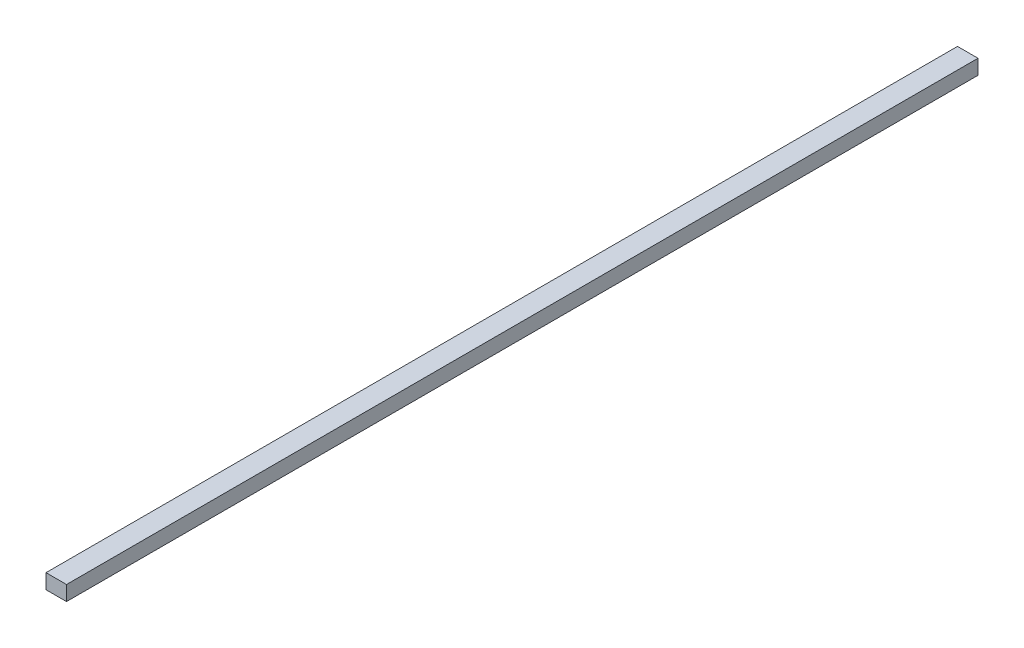
ISO-10303-21;
HEADER;
FILE_DESCRIPTION(('STEP AP214'),'2;1');
FILE_NAME('part.step','',(''),(''),'','','');
FILE_SCHEMA(('AUTOMOTIVE_DESIGN { 1 0 10303 214 1 1 1 1 }'));
ENDSEC;
DATA;
#1=APPLICATION_CONTEXT('core data for automotive mechanical design processes');
#2=APPLICATION_PROTOCOL_DEFINITION('international standard','automotive_design',2000,#1);
#3=PRODUCT_CONTEXT('',#1,'mechanical');
#4=PRODUCT('Part','Part','',(#3));
#5=PRODUCT_RELATED_PRODUCT_CATEGORY('part','',(#4));
#6=PRODUCT_DEFINITION_FORMATION('','',#4);
#7=PRODUCT_DEFINITION_CONTEXT('part definition',#1,'design');
#8=PRODUCT_DEFINITION('design','',#6,#7);
#9=PRODUCT_DEFINITION_SHAPE('','',#8);
#10=(LENGTH_UNIT() NAMED_UNIT(*) SI_UNIT(.MILLI.,.METRE.));
#11=(NAMED_UNIT(*) PLANE_ANGLE_UNIT() SI_UNIT($,.RADIAN.));
#12=(NAMED_UNIT(*) SI_UNIT($,.STERADIAN.) SOLID_ANGLE_UNIT());
#13=UNCERTAINTY_MEASURE_WITH_UNIT(LENGTH_MEASURE(1.E-05),#10,'distance_accuracy_value','');
#14=(GEOMETRIC_REPRESENTATION_CONTEXT(3) GLOBAL_UNCERTAINTY_ASSIGNED_CONTEXT((#13)) GLOBAL_UNIT_ASSIGNED_CONTEXT((#10,
#11,#12)) REPRESENTATION_CONTEXT('',''));
#15=CARTESIAN_POINT('',(0.,0.,0.));
#16=DIRECTION('',(0.,0.,1.));
#17=DIRECTION('',(1.,0.,0.));
#18=AXIS2_PLACEMENT_3D('',#15,#16,#17);
#19=CARTESIAN_POINT('',(0.,0.,400.));
#20=DIRECTION('',(1.,0.,0.));
#21=DIRECTION('',(0.,0.,-1.));
#22=AXIS2_PLACEMENT_3D('',#19,#20,#21);
#23=PLANE('',#22);
#24=DIRECTION('',(0.,-1.,0.));
#25=VECTOR('',#24,1.);
#26=CARTESIAN_POINT('',(0.,0.,0.));
#27=LINE('',#26,#25);
#28=CARTESIAN_POINT('',(0.,6.5,0.));
#29=VERTEX_POINT('',#28);
#30=CARTESIAN_POINT('',(0.,0.,0.));
#31=VERTEX_POINT('',#30);
#32=EDGE_CURVE('E98',#29,#31,#27,.T.);
#33=ORIENTED_EDGE('',*,*,#32,.T.);
#34=DIRECTION('',(0.,0.,-1.));
#35=VECTOR('',#34,1.);
#36=CARTESIAN_POINT('',(0.,0.,400.));
#37=LINE('',#36,#35);
#38=CARTESIAN_POINT('',(0.,0.,400.));
#39=VERTEX_POINT('',#38);
#40=EDGE_CURVE('E11',#39,#31,#37,.T.);
#41=ORIENTED_EDGE('',*,*,#40,.F.);
#42=DIRECTION('',(0.,-1.,0.));
#43=VECTOR('',#42,1.);
#44=CARTESIAN_POINT('',(0.,0.,400.));
#45=LINE('',#44,#43);
#46=CARTESIAN_POINT('',(0.,6.5,400.));
#47=VERTEX_POINT('',#46);
#48=EDGE_CURVE('E86',#47,#39,#45,.T.);
#49=ORIENTED_EDGE('',*,*,#48,.F.);
#50=DIRECTION('',(0.,0.,-1.));
#51=VECTOR('',#50,1.);
#52=CARTESIAN_POINT('',(0.,6.5,400.));
#53=LINE('',#52,#51);
#54=EDGE_CURVE('E94',#47,#29,#53,.T.);
#55=ORIENTED_EDGE('',*,*,#54,.T.);
#56=EDGE_LOOP('',(#33,#41,#49,#55));
#57=FACE_BOUND('',#56,.T.);
#58=ADVANCED_FACE('F35',(#57),#23,.F.);
#59=CARTESIAN_POINT('',(0.,0.,400.));
#60=DIRECTION('',(0.,1.,0.));
#61=DIRECTION('',(0.,0.,1.));
#62=AXIS2_PLACEMENT_3D('',#59,#60,#61);
#63=PLANE('',#62);
#64=DIRECTION('',(1.,0.,0.));
#65=VECTOR('',#64,1.);
#66=CARTESIAN_POINT('',(0.,0.,0.));
#67=LINE('',#66,#65);
#68=CARTESIAN_POINT('',(9.,0.,0.));
#69=VERTEX_POINT('',#68);
#70=EDGE_CURVE('E90',#31,#69,#67,.T.);
#71=ORIENTED_EDGE('',*,*,#70,.T.);
#72=DIRECTION('',(0.,0.,-1.));
#73=VECTOR('',#72,1.);
#74=CARTESIAN_POINT('',(9.,0.,400.));
#75=LINE('',#74,#73);
#76=CARTESIAN_POINT('',(9.,0.,400.));
#77=VERTEX_POINT('',#76);
#78=EDGE_CURVE('E43',#77,#69,#75,.T.);
#79=ORIENTED_EDGE('',*,*,#78,.F.);
#80=DIRECTION('',(1.,0.,0.));
#81=VECTOR('',#80,1.);
#82=CARTESIAN_POINT('',(0.,0.,400.));
#83=LINE('',#82,#81);
#84=EDGE_CURVE('E81',#39,#77,#83,.T.);
#85=ORIENTED_EDGE('',*,*,#84,.F.);
#86=ORIENTED_EDGE('',*,*,#40,.T.);
#87=EDGE_LOOP('',(#71,#79,#85,#86));
#88=FACE_BOUND('',#87,.T.);
#89=ADVANCED_FACE('F89',(#88),#63,.F.);
#90=CARTESIAN_POINT('',(9.,0.,400.));
#91=DIRECTION('',(-1.,0.,0.));
#92=DIRECTION('',(0.,0.,1.));
#93=AXIS2_PLACEMENT_3D('',#90,#91,#92);
#94=PLANE('',#93);
#95=DIRECTION('',(0.,1.,0.));
#96=VECTOR('',#95,1.);
#97=CARTESIAN_POINT('',(9.,0.,0.));
#98=LINE('',#97,#96);
#99=CARTESIAN_POINT('',(9.,6.5,0.));
#100=VERTEX_POINT('',#99);
#101=EDGE_CURVE('E68',#69,#100,#98,.T.);
#102=ORIENTED_EDGE('',*,*,#101,.T.);
#103=DIRECTION('',(0.,0.,-1.));
#104=VECTOR('',#103,1.);
#105=CARTESIAN_POINT('',(9.,6.5,400.));
#106=LINE('',#105,#104);
#107=CARTESIAN_POINT('',(9.,6.5,400.));
#108=VERTEX_POINT('',#107);
#109=EDGE_CURVE('E91',#108,#100,#106,.T.);
#110=ORIENTED_EDGE('',*,*,#109,.F.);
#111=DIRECTION('',(0.,1.,0.));
#112=VECTOR('',#111,1.);
#113=CARTESIAN_POINT('',(9.,0.,400.));
#114=LINE('',#113,#112);
#115=EDGE_CURVE('E84',#77,#108,#114,.T.);
#116=ORIENTED_EDGE('',*,*,#115,.F.);
#117=ORIENTED_EDGE('',*,*,#78,.T.);
#118=EDGE_LOOP('',(#102,#110,#116,#117));
#119=FACE_BOUND('',#118,.T.);
#120=ADVANCED_FACE('F92',(#119),#94,.F.);
#121=CARTESIAN_POINT('',(0.,6.5,400.));
#122=DIRECTION('',(0.,-1.,0.));
#123=DIRECTION('',(0.,0.,-1.));
#124=AXIS2_PLACEMENT_3D('',#121,#122,#123);
#125=PLANE('',#124);
#126=DIRECTION('',(-1.,0.,0.));
#127=VECTOR('',#126,1.);
#128=CARTESIAN_POINT('',(0.,6.5,0.));
#129=LINE('',#128,#127);
#130=EDGE_CURVE('E74',#100,#29,#129,.T.);
#131=ORIENTED_EDGE('',*,*,#130,.T.);
#132=ORIENTED_EDGE('',*,*,#54,.F.);
#133=DIRECTION('',(-1.,0.,0.));
#134=VECTOR('',#133,1.);
#135=CARTESIAN_POINT('',(0.,6.5,400.));
#136=LINE('',#135,#134);
#137=EDGE_CURVE('E51',#108,#47,#136,.T.);
#138=ORIENTED_EDGE('',*,*,#137,.F.);
#139=ORIENTED_EDGE('',*,*,#109,.T.);
#140=EDGE_LOOP('',(#131,#132,#138,#139));
#141=FACE_BOUND('',#140,.T.);
#142=ADVANCED_FACE('F105',(#141),#125,.F.);
#143=CARTESIAN_POINT('',(0.,0.,400.));
#144=DIRECTION('',(0.,0.,-1.));
#145=DIRECTION('',(-1.,0.,0.));
#146=AXIS2_PLACEMENT_3D('',#143,#144,#145);
#147=PLANE('',#146);
#148=ORIENTED_EDGE('',*,*,#48,.T.);
#149=ORIENTED_EDGE('',*,*,#84,.T.);
#150=ORIENTED_EDGE('',*,*,#115,.T.);
#151=ORIENTED_EDGE('',*,*,#137,.T.);
#152=EDGE_LOOP('',(#148,#149,#150,#151));
#153=FACE_BOUND('',#152,.T.);
#154=ADVANCED_FACE('F82',(#153),#147,.F.);
#155=CARTESIAN_POINT('',(0.,0.,0.));
#156=DIRECTION('',(0.,0.,-1.));
#157=DIRECTION('',(-1.,0.,0.));
#158=AXIS2_PLACEMENT_3D('',#155,#156,#157);
#159=PLANE('',#158);
#160=ORIENTED_EDGE('',*,*,#32,.F.);
#161=ORIENTED_EDGE('',*,*,#130,.F.);
#162=ORIENTED_EDGE('',*,*,#101,.F.);
#163=ORIENTED_EDGE('',*,*,#70,.F.);
#164=EDGE_LOOP('',(#160,#161,#162,#163));
#165=FACE_BOUND('',#164,.T.);
#166=ADVANCED_FACE('F108',(#165),#159,.T.);
#167=CLOSED_SHELL('',(#58,#89,#120,#142,#154,#166));
#168=MANIFOLD_SOLID_BREP('B2',#167);
#169=ADVANCED_BREP_SHAPE_REPRESENTATION('',(#18,#168),#14);
#170=SHAPE_DEFINITION_REPRESENTATION(#9,#169);
ENDSEC;
END-ISO-10303-21;
